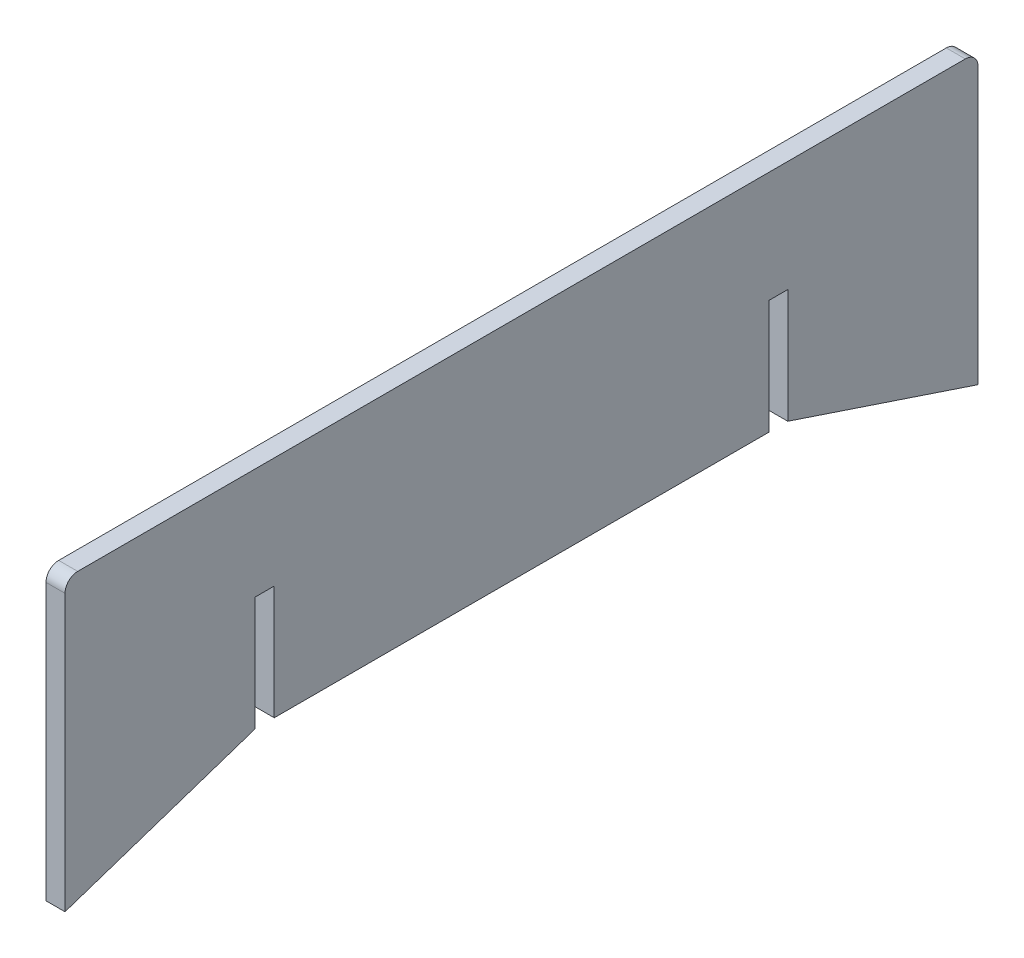
ISO-10303-21;
HEADER;
FILE_DESCRIPTION(('STEP AP214'),'2;1');
FILE_NAME('part.step','',(''),(''),'','','');
FILE_SCHEMA(('AUTOMOTIVE_DESIGN { 1 0 10303 214 1 1 1 1 }'));
ENDSEC;
DATA;
#1=APPLICATION_CONTEXT('core data for automotive mechanical design processes');
#2=APPLICATION_PROTOCOL_DEFINITION('international standard','automotive_design',2000,#1);
#3=PRODUCT_CONTEXT('',#1,'mechanical');
#4=PRODUCT('Part','Part','',(#3));
#5=PRODUCT_RELATED_PRODUCT_CATEGORY('part','',(#4));
#6=PRODUCT_DEFINITION_FORMATION('','',#4);
#7=PRODUCT_DEFINITION_CONTEXT('part definition',#1,'design');
#8=PRODUCT_DEFINITION('design','',#6,#7);
#9=PRODUCT_DEFINITION_SHAPE('','',#8);
#10=(LENGTH_UNIT() NAMED_UNIT(*) SI_UNIT(.MILLI.,.METRE.));
#11=(NAMED_UNIT(*) PLANE_ANGLE_UNIT() SI_UNIT($,.RADIAN.));
#12=(NAMED_UNIT(*) SI_UNIT($,.STERADIAN.) SOLID_ANGLE_UNIT());
#13=UNCERTAINTY_MEASURE_WITH_UNIT(LENGTH_MEASURE(1.E-05),#10,'distance_accuracy_value','');
#14=(GEOMETRIC_REPRESENTATION_CONTEXT(3) GLOBAL_UNCERTAINTY_ASSIGNED_CONTEXT((#13)) GLOBAL_UNIT_ASSIGNED_CONTEXT((#10,
#11,#12)) REPRESENTATION_CONTEXT('',''));
#15=CARTESIAN_POINT('',(0.,0.,0.));
#16=DIRECTION('',(0.,0.,1.));
#17=DIRECTION('',(1.,0.,0.));
#18=AXIS2_PLACEMENT_3D('',#15,#16,#17);
#19=CARTESIAN_POINT('',(3.,-17.75,-72.));
#20=DIRECTION('',(0.,0.,1.));
#21=DIRECTION('',(1.,0.,0.));
#22=AXIS2_PLACEMENT_3D('',#19,#20,#21);
#23=PLANE('',#22);
#24=DIRECTION('',(0.,1.,0.));
#25=VECTOR('',#24,1.);
#26=CARTESIAN_POINT('',(0.,-17.75,-72.));
#27=LINE('',#26,#25);
#28=CARTESIAN_POINT('',(0.,-27.75,-72.));
#29=VERTEX_POINT('',#28);
#30=CARTESIAN_POINT('',(0.,15.75,-72.));
#31=VERTEX_POINT('',#30);
#32=EDGE_CURVE('E146',#29,#31,#27,.T.);
#33=ORIENTED_EDGE('',*,*,#32,.T.);
#34=DIRECTION('',(-1.,0.,0.));
#35=VECTOR('',#34,1.);
#36=CARTESIAN_POINT('',(3.,15.75,-72.));
#37=LINE('',#36,#35);
#38=CARTESIAN_POINT('',(3.,15.75,-72.));
#39=VERTEX_POINT('',#38);
#40=EDGE_CURVE('E204',#31,#39,#37,.F.);
#41=ORIENTED_EDGE('',*,*,#40,.T.);
#42=DIRECTION('',(0.,1.,0.));
#43=VECTOR('',#42,1.);
#44=CARTESIAN_POINT('',(3.,-17.75,-72.));
#45=LINE('',#44,#43);
#46=CARTESIAN_POINT('',(3.,-27.75,-72.));
#47=VERTEX_POINT('',#46);
#48=EDGE_CURVE('E174',#47,#39,#45,.T.);
#49=ORIENTED_EDGE('',*,*,#48,.F.);
#50=DIRECTION('',(1.,0.,0.));
#51=VECTOR('',#50,1.);
#52=CARTESIAN_POINT('',(0.,-27.75,-72.));
#53=LINE('',#52,#51);
#54=EDGE_CURVE('E150',#29,#47,#53,.T.);
#55=ORIENTED_EDGE('',*,*,#54,.F.);
#56=EDGE_LOOP('',(#33,#41,#49,#55));
#57=FACE_BOUND('',#56,.T.);
#58=ADVANCED_FACE('F37',(#57),#23,.F.);
#59=CARTESIAN_POINT('',(3.,17.75,72.));
#60=DIRECTION('',(0.,-1.,0.));
#61=DIRECTION('',(0.,0.,-1.));
#62=AXIS2_PLACEMENT_3D('',#59,#60,#61);
#63=PLANE('',#62);
#64=DIRECTION('',(0.,0.,1.));
#65=VECTOR('',#64,1.);
#66=CARTESIAN_POINT('',(3.,17.75,72.));
#67=LINE('',#66,#65);
#68=CARTESIAN_POINT('',(3.,17.75,-70.));
#69=VERTEX_POINT('',#68);
#70=CARTESIAN_POINT('',(3.,17.75,70.));
#71=VERTEX_POINT('',#70);
#72=EDGE_CURVE('E177',#69,#71,#67,.T.);
#73=ORIENTED_EDGE('',*,*,#72,.F.);
#74=DIRECTION('',(-1.,0.,0.));
#75=VECTOR('',#74,1.);
#76=CARTESIAN_POINT('',(3.,17.75,-70.));
#77=LINE('',#76,#75);
#78=CARTESIAN_POINT('',(0.,17.75,-70.));
#79=VERTEX_POINT('',#78);
#80=EDGE_CURVE('E197',#69,#79,#77,.T.);
#81=ORIENTED_EDGE('',*,*,#80,.T.);
#82=DIRECTION('',(0.,0.,1.));
#83=VECTOR('',#82,1.);
#84=CARTESIAN_POINT('',(0.,17.75,72.));
#85=LINE('',#84,#83);
#86=CARTESIAN_POINT('',(0.,17.75,70.));
#87=VERTEX_POINT('',#86);
#88=EDGE_CURVE('E188',#79,#87,#85,.T.);
#89=ORIENTED_EDGE('',*,*,#88,.T.);
#90=DIRECTION('',(-1.,0.,0.));
#91=VECTOR('',#90,1.);
#92=CARTESIAN_POINT('',(3.,17.75,70.));
#93=LINE('',#92,#91);
#94=EDGE_CURVE('E186',#87,#71,#93,.F.);
#95=ORIENTED_EDGE('',*,*,#94,.T.);
#96=EDGE_LOOP('',(#73,#81,#89,#95));
#97=FACE_BOUND('',#96,.T.);
#98=ADVANCED_FACE('F216',(#97),#63,.F.);
#99=CARTESIAN_POINT('',(3.,-17.75,72.));
#100=DIRECTION('',(0.,0.,-1.));
#101=DIRECTION('',(-1.,0.,0.));
#102=AXIS2_PLACEMENT_3D('',#99,#100,#101);
#103=PLANE('',#102);
#104=DIRECTION('',(0.,-1.,0.));
#105=VECTOR('',#104,1.);
#106=CARTESIAN_POINT('',(3.,-17.75,72.));
#107=LINE('',#106,#105);
#108=CARTESIAN_POINT('',(3.,15.75,72.));
#109=VERTEX_POINT('',#108);
#110=CARTESIAN_POINT('',(3.,-27.75,72.));
#111=VERTEX_POINT('',#110);
#112=EDGE_CURVE('E181',#109,#111,#107,.T.);
#113=ORIENTED_EDGE('',*,*,#112,.F.);
#114=DIRECTION('',(-1.,0.,0.));
#115=VECTOR('',#114,1.);
#116=CARTESIAN_POINT('',(3.,15.75,72.));
#117=LINE('',#116,#115);
#118=CARTESIAN_POINT('',(0.,15.75,72.));
#119=VERTEX_POINT('',#118);
#120=EDGE_CURVE('E11',#109,#119,#117,.T.);
#121=ORIENTED_EDGE('',*,*,#120,.T.);
#122=DIRECTION('',(0.,-1.,0.));
#123=VECTOR('',#122,1.);
#124=CARTESIAN_POINT('',(0.,-17.75,72.));
#125=LINE('',#124,#123);
#126=CARTESIAN_POINT('',(0.,-27.75,72.));
#127=VERTEX_POINT('',#126);
#128=EDGE_CURVE('E192',#119,#127,#125,.T.);
#129=ORIENTED_EDGE('',*,*,#128,.T.);
#130=DIRECTION('',(1.,0.,0.));
#131=VECTOR('',#130,1.);
#132=CARTESIAN_POINT('',(0.,-27.75,72.));
#133=LINE('',#132,#131);
#134=EDGE_CURVE('E161',#127,#111,#133,.T.);
#135=ORIENTED_EDGE('',*,*,#134,.T.);
#136=EDGE_LOOP('',(#113,#121,#129,#135));
#137=FACE_BOUND('',#136,.T.);
#138=ADVANCED_FACE('F284',(#137),#103,.F.);
#139=CARTESIAN_POINT('',(3.,-17.75,72.));
#140=DIRECTION('',(0.,1.,0.));
#141=DIRECTION('',(0.,0.,1.));
#142=AXIS2_PLACEMENT_3D('',#139,#140,#141);
#143=PLANE('',#142);
#144=DIRECTION('',(0.,0.,-1.));
#145=VECTOR('',#144,1.);
#146=CARTESIAN_POINT('',(3.,-17.75,72.));
#147=LINE('',#146,#145);
#148=CARTESIAN_POINT('',(3.,-17.75,39.));
#149=VERTEX_POINT('',#148);
#150=CARTESIAN_POINT('',(3.,-17.75,-39.));
#151=VERTEX_POINT('',#150);
#152=EDGE_CURVE('E183',#149,#151,#147,.T.);
#153=ORIENTED_EDGE('',*,*,#152,.F.);
#154=DIRECTION('',(1.,0.,0.));
#155=VECTOR('',#154,1.);
#156=CARTESIAN_POINT('',(0.,-17.75,39.));
#157=LINE('',#156,#155);
#158=CARTESIAN_POINT('',(0.,-17.75,39.));
#159=VERTEX_POINT('',#158);
#160=EDGE_CURVE('E251',#159,#149,#157,.T.);
#161=ORIENTED_EDGE('',*,*,#160,.F.);
#162=DIRECTION('',(0.,0.,-1.));
#163=VECTOR('',#162,1.);
#164=CARTESIAN_POINT('',(0.,-17.75,72.));
#165=LINE('',#164,#163);
#166=CARTESIAN_POINT('',(0.,-17.75,-39.));
#167=VERTEX_POINT('',#166);
#168=EDGE_CURVE('E178',#159,#167,#165,.T.);
#169=ORIENTED_EDGE('',*,*,#168,.T.);
#170=DIRECTION('',(1.,0.,0.));
#171=VECTOR('',#170,1.);
#172=CARTESIAN_POINT('',(0.,-17.75,-39.));
#173=LINE('',#172,#171);
#174=EDGE_CURVE('E160',#167,#151,#173,.T.);
#175=ORIENTED_EDGE('',*,*,#174,.T.);
#176=EDGE_LOOP('',(#153,#161,#169,#175));
#177=FACE_BOUND('',#176,.T.);
#178=ADVANCED_FACE('F266',(#177),#143,.F.);
#179=CARTESIAN_POINT('',(3.,0.,0.));
#180=DIRECTION('',(-1.,0.,0.));
#181=DIRECTION('',(0.,0.,1.));
#182=AXIS2_PLACEMENT_3D('',#179,#180,#181);
#183=PLANE('',#182);
#184=ORIENTED_EDGE('',*,*,#112,.T.);
#185=DIRECTION('',(0.,0.316227766016838,-0.948683298050514));
#186=VECTOR('',#185,1.);
#187=CARTESIAN_POINT('',(3.,-27.75,72.));
#188=LINE('',#187,#186);
#189=CARTESIAN_POINT('',(3.,-17.75,42.));
#190=VERTEX_POINT('',#189);
#191=EDGE_CURVE('E221',#111,#190,#188,.T.);
#192=ORIENTED_EDGE('',*,*,#191,.T.);
#193=DIRECTION('',(0.,-1.,0.));
#194=VECTOR('',#193,1.);
#195=CARTESIAN_POINT('',(3.,-17.75,42.));
#196=LINE('',#195,#194);
#197=CARTESIAN_POINT('',(3.,0.25,42.));
#198=VERTEX_POINT('',#197);
#199=EDGE_CURVE('E240',#198,#190,#196,.T.);
#200=ORIENTED_EDGE('',*,*,#199,.F.);
#201=DIRECTION('',(0.,0.,1.));
#202=VECTOR('',#201,1.);
#203=CARTESIAN_POINT('',(3.,0.25,42.));
#204=LINE('',#203,#202);
#205=CARTESIAN_POINT('',(3.,0.25,39.));
#206=VERTEX_POINT('',#205);
#207=EDGE_CURVE('E235',#206,#198,#204,.T.);
#208=ORIENTED_EDGE('',*,*,#207,.F.);
#209=DIRECTION('',(0.,1.,0.));
#210=VECTOR('',#209,1.);
#211=CARTESIAN_POINT('',(3.,-17.75,39.));
#212=LINE('',#211,#210);
#213=EDGE_CURVE('E242',#149,#206,#212,.T.);
#214=ORIENTED_EDGE('',*,*,#213,.F.);
#215=ORIENTED_EDGE('',*,*,#152,.T.);
#216=DIRECTION('',(0.,-1.,0.));
#217=VECTOR('',#216,1.);
#218=CARTESIAN_POINT('',(3.,-17.75,-39.));
#219=LINE('',#218,#217);
#220=CARTESIAN_POINT('',(3.,0.25,-39.));
#221=VERTEX_POINT('',#220);
#222=EDGE_CURVE('E166',#221,#151,#219,.T.);
#223=ORIENTED_EDGE('',*,*,#222,.F.);
#224=DIRECTION('',(0.,0.,1.));
#225=VECTOR('',#224,1.);
#226=CARTESIAN_POINT('',(3.,0.25,-42.));
#227=LINE('',#226,#225);
#228=CARTESIAN_POINT('',(3.,0.25,-42.));
#229=VERTEX_POINT('',#228);
#230=EDGE_CURVE('E169',#229,#221,#227,.T.);
#231=ORIENTED_EDGE('',*,*,#230,.F.);
#232=DIRECTION('',(0.,1.,0.));
#233=VECTOR('',#232,1.);
#234=CARTESIAN_POINT('',(3.,-17.75,-42.));
#235=LINE('',#234,#233);
#236=CARTESIAN_POINT('',(3.,-17.75,-42.));
#237=VERTEX_POINT('',#236);
#238=EDGE_CURVE('E243',#237,#229,#235,.T.);
#239=ORIENTED_EDGE('',*,*,#238,.F.);
#240=DIRECTION('',(0.,0.316227766016838,0.948683298050514));
#241=VECTOR('',#240,1.);
#242=CARTESIAN_POINT('',(3.,-27.75,-72.));
#243=LINE('',#242,#241);
#244=EDGE_CURVE('E151',#47,#237,#243,.T.);
#245=ORIENTED_EDGE('',*,*,#244,.F.);
#246=ORIENTED_EDGE('',*,*,#48,.T.);
#247=CARTESIAN_POINT('',(3.,15.75,-70.));
#248=DIRECTION('',(-1.,0.,0.));
#249=DIRECTION('',(0.,0.,1.));
#250=AXIS2_PLACEMENT_3D('',#247,#248,#249);
#251=CIRCLE('',#250,2.);
#252=EDGE_CURVE('E45',#39,#69,#251,.F.);
#253=ORIENTED_EDGE('',*,*,#252,.T.);
#254=ORIENTED_EDGE('',*,*,#72,.T.);
#255=CARTESIAN_POINT('',(3.,15.75,70.));
#256=DIRECTION('',(-1.,0.,0.));
#257=DIRECTION('',(0.,0.,1.));
#258=AXIS2_PLACEMENT_3D('',#255,#256,#257);
#259=CIRCLE('',#258,2.);
#260=EDGE_CURVE('E206',#71,#109,#259,.F.);
#261=ORIENTED_EDGE('',*,*,#260,.T.);
#262=EDGE_LOOP('',(#184,#192,#200,#208,#214,#215,#223,#231,#239,#245,#246,#253,#254,#261));
#263=FACE_BOUND('',#262,.T.);
#264=ADVANCED_FACE('F210',(#263),#183,.F.);
#265=CARTESIAN_POINT('',(0.,0.,0.));
#266=DIRECTION('',(-1.,0.,0.));
#267=DIRECTION('',(0.,0.,1.));
#268=AXIS2_PLACEMENT_3D('',#265,#266,#267);
#269=PLANE('',#268);
#270=DIRECTION('',(0.,-1.,0.));
#271=VECTOR('',#270,1.);
#272=CARTESIAN_POINT('',(0.,-17.75,42.));
#273=LINE('',#272,#271);
#274=CARTESIAN_POINT('',(0.,0.25,42.));
#275=VERTEX_POINT('',#274);
#276=CARTESIAN_POINT('',(0.,-17.75,42.));
#277=VERTEX_POINT('',#276);
#278=EDGE_CURVE('E232',#275,#277,#273,.T.);
#279=ORIENTED_EDGE('',*,*,#278,.T.);
#280=DIRECTION('',(0.,0.316227766016838,-0.948683298050514));
#281=VECTOR('',#280,1.);
#282=CARTESIAN_POINT('',(0.,-27.75,72.));
#283=LINE('',#282,#281);
#284=EDGE_CURVE('E224',#127,#277,#283,.T.);
#285=ORIENTED_EDGE('',*,*,#284,.F.);
#286=ORIENTED_EDGE('',*,*,#128,.F.);
#287=CARTESIAN_POINT('',(0.,15.75,70.));
#288=DIRECTION('',(-1.,0.,0.));
#289=DIRECTION('',(0.,0.,1.));
#290=AXIS2_PLACEMENT_3D('',#287,#288,#289);
#291=CIRCLE('',#290,2.);
#292=EDGE_CURVE('E200',#119,#87,#291,.T.);
#293=ORIENTED_EDGE('',*,*,#292,.T.);
#294=ORIENTED_EDGE('',*,*,#88,.F.);
#295=CARTESIAN_POINT('',(0.,15.75,-70.));
#296=DIRECTION('',(-1.,0.,0.));
#297=DIRECTION('',(0.,0.,1.));
#298=AXIS2_PLACEMENT_3D('',#295,#296,#297);
#299=CIRCLE('',#298,2.);
#300=EDGE_CURVE('E202',#79,#31,#299,.T.);
#301=ORIENTED_EDGE('',*,*,#300,.T.);
#302=ORIENTED_EDGE('',*,*,#32,.F.);
#303=DIRECTION('',(0.,0.316227766016838,0.948683298050514));
#304=VECTOR('',#303,1.);
#305=CARTESIAN_POINT('',(0.,-27.75,-72.));
#306=LINE('',#305,#304);
#307=CARTESIAN_POINT('',(0.,-17.75,-42.));
#308=VERTEX_POINT('',#307);
#309=EDGE_CURVE('E138',#29,#308,#306,.T.);
#310=ORIENTED_EDGE('',*,*,#309,.T.);
#311=DIRECTION('',(0.,1.,0.));
#312=VECTOR('',#311,1.);
#313=CARTESIAN_POINT('',(0.,-17.75,-42.));
#314=LINE('',#313,#312);
#315=CARTESIAN_POINT('',(0.,0.25,-42.));
#316=VERTEX_POINT('',#315);
#317=EDGE_CURVE('E144',#308,#316,#314,.T.);
#318=ORIENTED_EDGE('',*,*,#317,.T.);
#319=DIRECTION('',(0.,0.,1.));
#320=VECTOR('',#319,1.);
#321=CARTESIAN_POINT('',(0.,0.25,-42.));
#322=LINE('',#321,#320);
#323=CARTESIAN_POINT('',(0.,0.25,-39.));
#324=VERTEX_POINT('',#323);
#325=EDGE_CURVE('E167',#316,#324,#322,.T.);
#326=ORIENTED_EDGE('',*,*,#325,.T.);
#327=DIRECTION('',(0.,-1.,0.));
#328=VECTOR('',#327,1.);
#329=CARTESIAN_POINT('',(0.,-17.75,-39.));
#330=LINE('',#329,#328);
#331=EDGE_CURVE('E60',#324,#167,#330,.T.);
#332=ORIENTED_EDGE('',*,*,#331,.T.);
#333=ORIENTED_EDGE('',*,*,#168,.F.);
#334=DIRECTION('',(0.,1.,0.));
#335=VECTOR('',#334,1.);
#336=CARTESIAN_POINT('',(0.,-17.75,39.));
#337=LINE('',#336,#335);
#338=CARTESIAN_POINT('',(0.,0.25,39.));
#339=VERTEX_POINT('',#338);
#340=EDGE_CURVE('E234',#159,#339,#337,.T.);
#341=ORIENTED_EDGE('',*,*,#340,.T.);
#342=DIRECTION('',(0.,0.,1.));
#343=VECTOR('',#342,1.);
#344=CARTESIAN_POINT('',(0.,0.25,42.));
#345=LINE('',#344,#343);
#346=EDGE_CURVE('E52',#339,#275,#345,.T.);
#347=ORIENTED_EDGE('',*,*,#346,.T.);
#348=EDGE_LOOP('',(#279,#285,#286,#293,#294,#301,#302,#310,#318,#326,#332,#333,#341,#347));
#349=FACE_BOUND('',#348,.T.);
#350=ADVANCED_FACE('F141',(#349),#269,.T.);
#351=CARTESIAN_POINT('',(3.,15.75,-70.));
#352=DIRECTION('',(-1.,0.,0.));
#353=DIRECTION('',(0.,0.,1.));
#354=AXIS2_PLACEMENT_3D('',#351,#352,#353);
#355=CYLINDRICAL_SURFACE('',#354,2.);
#356=ORIENTED_EDGE('',*,*,#252,.F.);
#357=ORIENTED_EDGE('',*,*,#40,.F.);
#358=ORIENTED_EDGE('',*,*,#300,.F.);
#359=ORIENTED_EDGE('',*,*,#80,.F.);
#360=EDGE_LOOP('',(#356,#357,#358,#359));
#361=FACE_BOUND('',#360,.T.);
#362=ADVANCED_FACE('F219',(#361),#355,.T.);
#363=CARTESIAN_POINT('',(3.,15.75,70.));
#364=DIRECTION('',(-1.,0.,0.));
#365=DIRECTION('',(0.,0.,1.));
#366=AXIS2_PLACEMENT_3D('',#363,#364,#365);
#367=CYLINDRICAL_SURFACE('',#366,2.);
#368=ORIENTED_EDGE('',*,*,#260,.F.);
#369=ORIENTED_EDGE('',*,*,#94,.F.);
#370=ORIENTED_EDGE('',*,*,#292,.F.);
#371=ORIENTED_EDGE('',*,*,#120,.F.);
#372=EDGE_LOOP('',(#368,#369,#370,#371));
#373=FACE_BOUND('',#372,.T.);
#374=ADVANCED_FACE('F39',(#373),#367,.T.);
#375=CARTESIAN_POINT('',(0.,-17.75,-42.));
#376=DIRECTION('',(0.,0.,-1.));
#377=DIRECTION('',(-1.,0.,0.));
#378=AXIS2_PLACEMENT_3D('',#375,#376,#377);
#379=PLANE('',#378);
#380=ORIENTED_EDGE('',*,*,#238,.T.);
#381=DIRECTION('',(1.,0.,0.));
#382=VECTOR('',#381,1.);
#383=CARTESIAN_POINT('',(0.,0.25,-42.));
#384=LINE('',#383,#382);
#385=EDGE_CURVE('E164',#316,#229,#384,.T.);
#386=ORIENTED_EDGE('',*,*,#385,.F.);
#387=ORIENTED_EDGE('',*,*,#317,.F.);
#388=DIRECTION('',(1.,0.,0.));
#389=VECTOR('',#388,1.);
#390=CARTESIAN_POINT('',(0.,-17.75,-42.));
#391=LINE('',#390,#389);
#392=EDGE_CURVE('E154',#308,#237,#391,.T.);
#393=ORIENTED_EDGE('',*,*,#392,.T.);
#394=EDGE_LOOP('',(#380,#386,#387,#393));
#395=FACE_BOUND('',#394,.T.);
#396=ADVANCED_FACE('F163',(#395),#379,.F.);
#397=CARTESIAN_POINT('',(0.,-17.75,-39.));
#398=DIRECTION('',(0.,0.,1.));
#399=DIRECTION('',(1.,0.,0.));
#400=AXIS2_PLACEMENT_3D('',#397,#398,#399);
#401=PLANE('',#400);
#402=ORIENTED_EDGE('',*,*,#222,.T.);
#403=ORIENTED_EDGE('',*,*,#174,.F.);
#404=ORIENTED_EDGE('',*,*,#331,.F.);
#405=DIRECTION('',(1.,0.,0.));
#406=VECTOR('',#405,1.);
#407=CARTESIAN_POINT('',(0.,0.25,-39.));
#408=LINE('',#407,#406);
#409=EDGE_CURVE('E256',#324,#221,#408,.T.);
#410=ORIENTED_EDGE('',*,*,#409,.T.);
#411=EDGE_LOOP('',(#402,#403,#404,#410));
#412=FACE_BOUND('',#411,.T.);
#413=ADVANCED_FACE('F292',(#412),#401,.F.);
#414=CARTESIAN_POINT('',(0.,0.25,-42.));
#415=DIRECTION('',(0.,1.,0.));
#416=DIRECTION('',(0.,0.,1.));
#417=AXIS2_PLACEMENT_3D('',#414,#415,#416);
#418=PLANE('',#417);
#419=ORIENTED_EDGE('',*,*,#230,.T.);
#420=ORIENTED_EDGE('',*,*,#409,.F.);
#421=ORIENTED_EDGE('',*,*,#325,.F.);
#422=ORIENTED_EDGE('',*,*,#385,.T.);
#423=EDGE_LOOP('',(#419,#420,#421,#422));
#424=FACE_BOUND('',#423,.T.);
#425=ADVANCED_FACE('F311',(#424),#418,.F.);
#426=CARTESIAN_POINT('',(0.,-17.75,42.));
#427=DIRECTION('',(0.,0.,1.));
#428=DIRECTION('',(1.,0.,0.));
#429=AXIS2_PLACEMENT_3D('',#426,#427,#428);
#430=PLANE('',#429);
#431=ORIENTED_EDGE('',*,*,#199,.T.);
#432=DIRECTION('',(1.,0.,0.));
#433=VECTOR('',#432,1.);
#434=CARTESIAN_POINT('',(0.,-17.75,42.));
#435=LINE('',#434,#433);
#436=EDGE_CURVE('E239',#277,#190,#435,.T.);
#437=ORIENTED_EDGE('',*,*,#436,.F.);
#438=ORIENTED_EDGE('',*,*,#278,.F.);
#439=DIRECTION('',(1.,0.,0.));
#440=VECTOR('',#439,1.);
#441=CARTESIAN_POINT('',(0.,0.25,42.));
#442=LINE('',#441,#440);
#443=EDGE_CURVE('E189',#275,#198,#442,.T.);
#444=ORIENTED_EDGE('',*,*,#443,.T.);
#445=EDGE_LOOP('',(#431,#437,#438,#444));
#446=FACE_BOUND('',#445,.T.);
#447=ADVANCED_FACE('F313',(#446),#430,.F.);
#448=CARTESIAN_POINT('',(0.,0.25,42.));
#449=DIRECTION('',(0.,1.,0.));
#450=DIRECTION('',(0.,0.,1.));
#451=AXIS2_PLACEMENT_3D('',#448,#449,#450);
#452=PLANE('',#451);
#453=ORIENTED_EDGE('',*,*,#207,.T.);
#454=ORIENTED_EDGE('',*,*,#443,.F.);
#455=ORIENTED_EDGE('',*,*,#346,.F.);
#456=DIRECTION('',(1.,0.,0.));
#457=VECTOR('',#456,1.);
#458=CARTESIAN_POINT('',(0.,0.25,39.));
#459=LINE('',#458,#457);
#460=EDGE_CURVE('E249',#339,#206,#459,.T.);
#461=ORIENTED_EDGE('',*,*,#460,.T.);
#462=EDGE_LOOP('',(#453,#454,#455,#461));
#463=FACE_BOUND('',#462,.T.);
#464=ADVANCED_FACE('F273',(#463),#452,.F.);
#465=CARTESIAN_POINT('',(0.,-17.75,39.));
#466=DIRECTION('',(0.,0.,-1.));
#467=DIRECTION('',(-1.,0.,0.));
#468=AXIS2_PLACEMENT_3D('',#465,#466,#467);
#469=PLANE('',#468);
#470=ORIENTED_EDGE('',*,*,#213,.T.);
#471=ORIENTED_EDGE('',*,*,#460,.F.);
#472=ORIENTED_EDGE('',*,*,#340,.F.);
#473=ORIENTED_EDGE('',*,*,#160,.T.);
#474=EDGE_LOOP('',(#470,#471,#472,#473));
#475=FACE_BOUND('',#474,.T.);
#476=ADVANCED_FACE('F269',(#475),#469,.F.);
#477=CARTESIAN_POINT('',(0.,-27.75,72.));
#478=DIRECTION('',(0.,-0.948683298050514,-0.316227766016838));
#479=DIRECTION('',(0.,0.316227766016838,-0.948683298050514));
#480=AXIS2_PLACEMENT_3D('',#477,#478,#479);
#481=PLANE('',#480);
#482=ORIENTED_EDGE('',*,*,#191,.F.);
#483=ORIENTED_EDGE('',*,*,#134,.F.);
#484=ORIENTED_EDGE('',*,*,#284,.T.);
#485=ORIENTED_EDGE('',*,*,#436,.T.);
#486=EDGE_LOOP('',(#482,#483,#484,#485));
#487=FACE_BOUND('',#486,.T.);
#488=ADVANCED_FACE('F281',(#487),#481,.T.);
#489=CARTESIAN_POINT('',(0.,-27.75,-72.));
#490=DIRECTION('',(0.,0.948683298050514,-0.316227766016838));
#491=DIRECTION('',(0.,0.316227766016838,0.948683298050514));
#492=AXIS2_PLACEMENT_3D('',#489,#490,#491);
#493=PLANE('',#492);
#494=ORIENTED_EDGE('',*,*,#244,.T.);
#495=ORIENTED_EDGE('',*,*,#392,.F.);
#496=ORIENTED_EDGE('',*,*,#309,.F.);
#497=ORIENTED_EDGE('',*,*,#54,.T.);
#498=EDGE_LOOP('',(#494,#495,#496,#497));
#499=FACE_BOUND('',#498,.T.);
#500=ADVANCED_FACE('F155',(#499),#493,.F.);
#501=CLOSED_SHELL('',(#58,#98,#138,#178,#264,#350,#362,#374,#396,#413,#425,#447,#464,#476,#488,#500));
#502=MANIFOLD_SOLID_BREP('B2',#501);
#503=ADVANCED_BREP_SHAPE_REPRESENTATION('',(#18,#502),#14);
#504=SHAPE_DEFINITION_REPRESENTATION(#9,#503);
ENDSEC;
END-ISO-10303-21;
